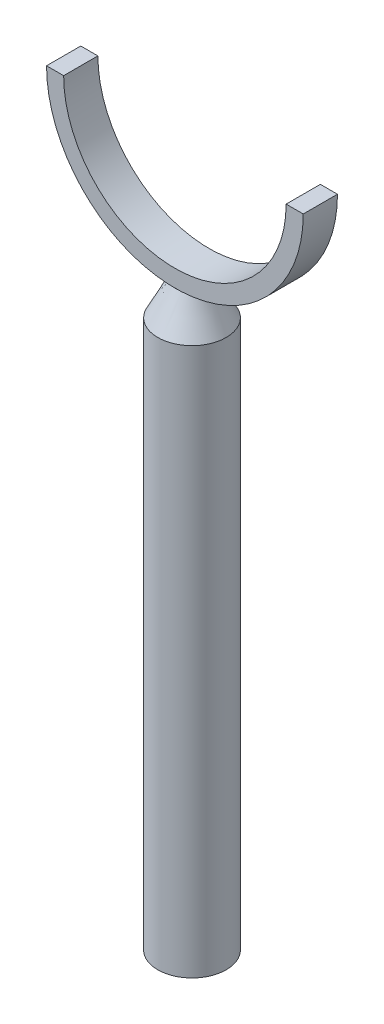
ISO-10303-21;
HEADER;
FILE_DESCRIPTION(('STEP AP214'),'2;1');
FILE_NAME('part.step','',(''),(''),'','','');
FILE_SCHEMA(('AUTOMOTIVE_DESIGN { 1 0 10303 214 1 1 1 1 }'));
ENDSEC;
DATA;
#1=APPLICATION_CONTEXT('core data for automotive mechanical design processes');
#2=APPLICATION_PROTOCOL_DEFINITION('international standard','automotive_design',2000,#1);
#3=PRODUCT_CONTEXT('',#1,'mechanical');
#4=PRODUCT('Part','Part','',(#3));
#5=PRODUCT_RELATED_PRODUCT_CATEGORY('part','',(#4));
#6=PRODUCT_DEFINITION_FORMATION('','',#4);
#7=PRODUCT_DEFINITION_CONTEXT('part definition',#1,'design');
#8=PRODUCT_DEFINITION('design','',#6,#7);
#9=PRODUCT_DEFINITION_SHAPE('','',#8);
#10=(LENGTH_UNIT() NAMED_UNIT(*) SI_UNIT(.MILLI.,.METRE.));
#11=(NAMED_UNIT(*) PLANE_ANGLE_UNIT() SI_UNIT($,.RADIAN.));
#12=(NAMED_UNIT(*) SI_UNIT($,.STERADIAN.) SOLID_ANGLE_UNIT());
#13=UNCERTAINTY_MEASURE_WITH_UNIT(LENGTH_MEASURE(1.E-05),#10,'distance_accuracy_value','');
#14=(GEOMETRIC_REPRESENTATION_CONTEXT(3) GLOBAL_UNCERTAINTY_ASSIGNED_CONTEXT((#13)) GLOBAL_UNIT_ASSIGNED_CONTEXT((#10,
#11,#12)) REPRESENTATION_CONTEXT('',''));
#15=CARTESIAN_POINT('',(0.,0.,0.));
#16=DIRECTION('',(0.,0.,1.));
#17=DIRECTION('',(1.,0.,0.));
#18=AXIS2_PLACEMENT_3D('',#15,#16,#17);
#19=CARTESIAN_POINT('',(0.,207.5,4.99999999999999));
#20=DIRECTION('',(0.,0.,-1.));
#21=DIRECTION('',(-1.,0.,0.));
#22=AXIS2_PLACEMENT_3D('',#19,#20,#21);
#23=CYLINDRICAL_SURFACE('',#22,32.5);
#24=DIRECTION('',(0.,0.,-1.));
#25=VECTOR('',#24,1.);
#26=CARTESIAN_POINT('',(32.5,207.5,4.99999999999999));
#27=LINE('',#26,#25);
#28=CARTESIAN_POINT('',(32.5,207.5,4.99999999999999));
#29=VERTEX_POINT('',#28);
#30=CARTESIAN_POINT('',(32.5,207.5,-4.99999999999999));
#31=VERTEX_POINT('',#30);
#32=EDGE_CURVE('E58',#29,#31,#27,.T.);
#33=ORIENTED_EDGE('',*,*,#32,.T.);
#34=CARTESIAN_POINT('',(0.,207.5,-4.99999999999999));
#35=DIRECTION('',(0.,0.,1.));
#36=DIRECTION('',(1.,0.,0.));
#37=AXIS2_PLACEMENT_3D('',#34,#35,#36);
#38=CIRCLE('',#37,32.5);
#39=CARTESIAN_POINT('',(-32.5,207.5,-4.99999999999999));
#40=VERTEX_POINT('',#39);
#41=EDGE_CURVE('E95',#40,#31,#38,.T.);
#42=ORIENTED_EDGE('',*,*,#41,.F.);
#43=DIRECTION('',(0.,0.,-1.));
#44=VECTOR('',#43,1.);
#45=CARTESIAN_POINT('',(-32.5,207.5,4.99999999999999));
#46=LINE('',#45,#44);
#47=CARTESIAN_POINT('',(-32.5,207.5,4.99999999999999));
#48=VERTEX_POINT('',#47);
#49=EDGE_CURVE('E13',#48,#40,#46,.T.);
#50=ORIENTED_EDGE('',*,*,#49,.F.);
#51=CARTESIAN_POINT('',(0.,207.5,4.99999999999999));
#52=DIRECTION('',(0.,0.,1.));
#53=DIRECTION('',(1.,0.,0.));
#54=AXIS2_PLACEMENT_3D('',#51,#52,#53);
#55=CIRCLE('',#54,32.5);
#56=EDGE_CURVE('E96',#48,#29,#55,.T.);
#57=ORIENTED_EDGE('',*,*,#56,.T.);
#58=EDGE_LOOP('',(#33,#42,#50,#57));
#59=FACE_BOUND('',#58,.T.);
#60=ADVANCED_FACE('F55',(#59),#23,.F.);
#61=CARTESIAN_POINT('',(-37.5,207.5,4.99999999999999));
#62=DIRECTION('',(0.,1.,0.));
#63=DIRECTION('',(0.,0.,1.));
#64=AXIS2_PLACEMENT_3D('',#61,#62,#63);
#65=PLANE('',#64);
#66=ORIENTED_EDGE('',*,*,#49,.T.);
#67=DIRECTION('',(1.,0.,0.));
#68=VECTOR('',#67,1.);
#69=CARTESIAN_POINT('',(-37.5,207.5,-4.99999999999999));
#70=LINE('',#69,#68);
#71=CARTESIAN_POINT('',(-37.5,207.5,-4.99999999999999));
#72=VERTEX_POINT('',#71);
#73=EDGE_CURVE('E113',#72,#40,#70,.T.);
#74=ORIENTED_EDGE('',*,*,#73,.F.);
#75=DIRECTION('',(0.,0.,-1.));
#76=VECTOR('',#75,1.);
#77=CARTESIAN_POINT('',(-37.5,207.5,4.99999999999999));
#78=LINE('',#77,#76);
#79=CARTESIAN_POINT('',(-37.5,207.5,4.99999999999999));
#80=VERTEX_POINT('',#79);
#81=EDGE_CURVE('E63',#80,#72,#78,.T.);
#82=ORIENTED_EDGE('',*,*,#81,.F.);
#83=DIRECTION('',(1.,0.,0.));
#84=VECTOR('',#83,1.);
#85=CARTESIAN_POINT('',(-37.5,207.5,4.99999999999999));
#86=LINE('',#85,#84);
#87=EDGE_CURVE('E101',#80,#48,#86,.T.);
#88=ORIENTED_EDGE('',*,*,#87,.T.);
#89=EDGE_LOOP('',(#66,#74,#82,#88));
#90=FACE_BOUND('',#89,.T.);
#91=ADVANCED_FACE('F127',(#90),#65,.T.);
#92=CARTESIAN_POINT('',(0.,207.5,4.99999999999999));
#93=DIRECTION('',(0.,0.,-1.));
#94=DIRECTION('',(-1.,0.,0.));
#95=AXIS2_PLACEMENT_3D('',#92,#93,#94);
#96=CYLINDRICAL_SURFACE('',#95,37.5);
#97=ORIENTED_EDGE('',*,*,#81,.T.);
#98=CARTESIAN_POINT('',(0.,207.5,-4.99999999999999));
#99=DIRECTION('',(0.,0.,1.));
#100=DIRECTION('',(1.,0.,0.));
#101=AXIS2_PLACEMENT_3D('',#98,#99,#100);
#102=CIRCLE('',#101,37.5);
#103=CARTESIAN_POINT('',(37.5,207.5,-4.99999999999999));
#104=VERTEX_POINT('',#103);
#105=EDGE_CURVE('E109',#72,#104,#102,.T.);
#106=ORIENTED_EDGE('',*,*,#105,.T.);
#107=DIRECTION('',(0.,0.,-1.));
#108=VECTOR('',#107,1.);
#109=CARTESIAN_POINT('',(37.5,207.5,4.99999999999999));
#110=LINE('',#109,#108);
#111=CARTESIAN_POINT('',(37.5,207.5,4.99999999999999));
#112=VERTEX_POINT('',#111);
#113=EDGE_CURVE('E100',#112,#104,#110,.T.);
#114=ORIENTED_EDGE('',*,*,#113,.F.);
#115=CARTESIAN_POINT('',(0.,207.5,4.99999999999999));
#116=DIRECTION('',(0.,0.,1.));
#117=DIRECTION('',(1.,0.,0.));
#118=AXIS2_PLACEMENT_3D('',#115,#116,#117);
#119=CIRCLE('',#118,37.5);
#120=EDGE_CURVE('E121',#80,#112,#119,.T.);
#121=ORIENTED_EDGE('',*,*,#120,.F.);
#122=EDGE_LOOP('',(#97,#106,#114,#121));
#123=FACE_BOUND('',#122,.T.);
#124=ADVANCED_FACE('F125',(#123),#96,.T.);
#125=CARTESIAN_POINT('',(32.5,207.5,4.99999999999999));
#126=DIRECTION('',(0.,1.,0.));
#127=DIRECTION('',(0.,0.,1.));
#128=AXIS2_PLACEMENT_3D('',#125,#126,#127);
#129=PLANE('',#128);
#130=ORIENTED_EDGE('',*,*,#113,.T.);
#131=DIRECTION('',(1.,0.,0.));
#132=VECTOR('',#131,1.);
#133=CARTESIAN_POINT('',(32.5,207.5,-4.99999999999999));
#134=LINE('',#133,#132);
#135=EDGE_CURVE('E103',#31,#104,#134,.T.);
#136=ORIENTED_EDGE('',*,*,#135,.F.);
#137=ORIENTED_EDGE('',*,*,#32,.F.);
#138=DIRECTION('',(1.,0.,0.));
#139=VECTOR('',#138,1.);
#140=CARTESIAN_POINT('',(32.5,207.5,4.99999999999999));
#141=LINE('',#140,#139);
#142=EDGE_CURVE('E119',#29,#112,#141,.T.);
#143=ORIENTED_EDGE('',*,*,#142,.T.);
#144=EDGE_LOOP('',(#130,#136,#137,#143));
#145=FACE_BOUND('',#144,.T.);
#146=ADVANCED_FACE('F104',(#145),#129,.T.);
#147=CARTESIAN_POINT('',(0.,207.5,4.99999999999999));
#148=DIRECTION('',(0.,0.,1.));
#149=DIRECTION('',(1.,0.,0.));
#150=AXIS2_PLACEMENT_3D('',#147,#148,#149);
#151=PLANE('',#150);
#152=ORIENTED_EDGE('',*,*,#56,.F.);
#153=ORIENTED_EDGE('',*,*,#87,.F.);
#154=ORIENTED_EDGE('',*,*,#120,.T.);
#155=ORIENTED_EDGE('',*,*,#142,.F.);
#156=EDGE_LOOP('',(#152,#153,#154,#155));
#157=FACE_BOUND('',#156,.T.);
#158=ADVANCED_FACE('F129',(#157),#151,.T.);
#159=CARTESIAN_POINT('',(0.,207.5,-4.99999999999999));
#160=DIRECTION('',(0.,0.,1.));
#161=DIRECTION('',(1.,0.,0.));
#162=AXIS2_PLACEMENT_3D('',#159,#160,#161);
#163=PLANE('',#162);
#164=ORIENTED_EDGE('',*,*,#41,.T.);
#165=ORIENTED_EDGE('',*,*,#135,.T.);
#166=ORIENTED_EDGE('',*,*,#105,.F.);
#167=ORIENTED_EDGE('',*,*,#73,.T.);
#168=EDGE_LOOP('',(#164,#165,#166,#167));
#169=FACE_BOUND('',#168,.T.);
#170=ADVANCED_FACE('F112',(#169),#163,.F.);
#171=CLOSED_SHELL('',(#60,#91,#124,#146,#158,#170));
#172=MANIFOLD_SOLID_BREP('B2',#171);
#173=CARTESIAN_POINT('',(0.,160.,0.));
#174=DIRECTION('',(0.,-1.,0.));
#175=DIRECTION('',(0.,0.,-1.));
#176=AXIS2_PLACEMENT_3D('',#173,#174,#175);
#177=CYLINDRICAL_SURFACE('',#176,10.);
#178=CARTESIAN_POINT('',(0.,160.,0.));
#179=DIRECTION('',(0.,-1.,0.));
#180=DIRECTION('',(0.,0.,-1.));
#181=AXIS2_PLACEMENT_3D('',#178,#179,#180);
#182=CIRCLE('',#181,10.);
#183=CARTESIAN_POINT('',(0.941083133185143,160.,9.9556196460308));
#184=VERTEX_POINT('',#183);
#185=EDGE_CURVE('E54',#184,#184,#182,.F.);
#186=ORIENTED_EDGE('',*,*,#185,.F.);
#187=EDGE_LOOP('',(#186));
#188=FACE_BOUND('',#187,.T.);
#189=CARTESIAN_POINT('',(0.,0.,0.));
#190=DIRECTION('',(0.,1.,0.));
#191=DIRECTION('',(0.,0.,1.));
#192=AXIS2_PLACEMENT_3D('',#189,#190,#191);
#193=CIRCLE('',#192,10.);
#194=CARTESIAN_POINT('',(0.,0.,10.));
#195=VERTEX_POINT('',#194);
#196=EDGE_CURVE('E200',#195,#195,#193,.T.);
#197=ORIENTED_EDGE('',*,*,#196,.T.);
#198=EDGE_LOOP('',(#197));
#199=FACE_BOUND('',#198,.T.);
#200=ADVANCED_FACE('F191',(#188,#199),#177,.T.);
#201=CARTESIAN_POINT('',(0.,0.,0.));
#202=DIRECTION('',(0.,1.,0.));
#203=DIRECTION('',(0.,0.,1.));
#204=AXIS2_PLACEMENT_3D('',#201,#202,#203);
#205=PLANE('',#204);
#206=ORIENTED_EDGE('',*,*,#196,.F.);
#207=EDGE_LOOP('',(#206));
#208=FACE_BOUND('',#207,.T.);
#209=ADVANCED_FACE('F226',(#208),#205,.F.);
#210=CARTESIAN_POINT('',(0.,170.,0.));
#211=DIRECTION('',(0.,1.,0.));
#212=DIRECTION('',(0.,0.,1.));
#213=AXIS2_PLACEMENT_3D('',#210,#211,#212);
#214=PLANE('',#213);
#215=CARTESIAN_POINT('',(0.,170.,0.));
#216=DIRECTION('',(0.,1.,0.));
#217=DIRECTION('',(0.,0.,1.));
#218=AXIS2_PLACEMENT_3D('',#215,#216,#217);
#219=CIRCLE('',#218,5.);
#220=CARTESIAN_POINT('',(1.84646326654365,170.,4.64656576465942));
#221=VERTEX_POINT('',#220);
#222=EDGE_CURVE('E194',#221,#221,#219,.T.);
#223=ORIENTED_EDGE('',*,*,#222,.T.);
#224=EDGE_LOOP('',(#223));
#225=FACE_BOUND('',#224,.T.);
#226=ADVANCED_FACE('F216',(#225),#214,.T.);
#227=CARTESIAN_POINT('',(0.941083133185143,160.,9.9556196460308));
#228=CARTESIAN_POINT('',(1.84646326654365,170.,4.64656576465942));
#229=CARTESIAN_POINT('',(20.8523224252467,160.,8.07345337966052));
#230=CARTESIAN_POINT('',(11.1395947958625,170.,0.953639231572114));
#231=CARTESIAN_POINT('',(18.9701561588765,160.,-11.8377859124011));
#232=CARTESIAN_POINT('',(7.44666826277518,170.,-8.33949229774672));
#233=CARTESIAN_POINT('',(-0.941083133185141,160.,-9.9556196460308));
#234=CARTESIAN_POINT('',(-1.84646326654365,170.,-4.64656576465942));
#235=CARTESIAN_POINT('',(-20.8523224252468,160.,-8.07345337966052));
#236=CARTESIAN_POINT('',(-11.1395947958625,170.,-0.953639231572117));
#237=CARTESIAN_POINT('',(-18.9701561588765,160.,11.8377859124011));
#238=CARTESIAN_POINT('',(-7.44666826277518,170.,8.33949229774672));
#239=CARTESIAN_POINT('',(0.941083133185143,160.,9.9556196460308));
#240=CARTESIAN_POINT('',(1.84646326654365,170.,4.64656576465942));
#241=(BOUNDED_SURFACE() B_SPLINE_SURFACE(3,1,((#227,#228),(#229,#230),(#231,#232),(#233,#234),
(#235,#236),(#237,#238),(#239,#240)),.UNSPECIFIED.,.T.,.F.,.F.) B_SPLINE_SURFACE_WITH_KNOTS((4,
3,4),(2,2),(0.,0.5,1.),(0.,1.),
.UNSPECIFIED.) GEOMETRIC_REPRESENTATION_ITEM() RATIONAL_B_SPLINE_SURFACE(((1.,1.),
(0.333333333333333,0.333333333333333),(0.333333333333333,0.333333333333333),(1.,1.),
(0.333333333333333,0.333333333333333),(0.333333333333333,0.333333333333333),(1.,1.))) REPRESENTATION_ITEM('') SURFACE());
#242=CARTESIAN_POINT('',(0.941083133185143,160.,9.9556196460308));
#243=CARTESIAN_POINT('',(0.950514176240961,160.104166666667,9.90031700143318));
#244=CARTESIAN_POINT('',(0.959945219296779,160.208333333333,9.84501435683556));
#245=CARTESIAN_POINT('',(0.978807305408414,160.416666666667,9.73440906764033));
#246=CARTESIAN_POINT('',(0.988238348464232,160.520833333333,9.67910642304271));
#247=CARTESIAN_POINT('',(1.00710043457587,160.729166666667,9.56850113384747));
#248=CARTESIAN_POINT('',(1.01653147763169,160.833333333333,9.51319848924985));
#249=CARTESIAN_POINT('',(1.03539356374332,161.041666666667,9.40259320005461));
#250=CARTESIAN_POINT('',(1.04482460679914,161.145833333333,9.347290555457));
#251=CARTESIAN_POINT('',(1.06368669291077,161.354166666667,9.23668526626176));
#252=CARTESIAN_POINT('',(1.07311773596659,161.458333333333,9.18138262166414));
#253=CARTESIAN_POINT('',(1.09197982207823,161.666666666667,9.0707773324689));
#254=CARTESIAN_POINT('',(1.10141086513405,161.770833333333,9.01547468787128));
#255=CARTESIAN_POINT('',(1.12027295124568,161.979166666667,8.90486939867605));
#256=CARTESIAN_POINT('',(1.1297039943015,162.083333333333,8.84956675407843));
#257=CARTESIAN_POINT('',(1.14856608041313,162.291666666667,8.73896146488319));
#258=CARTESIAN_POINT('',(1.15799712346895,162.395833333333,8.68365882028557));
#259=CARTESIAN_POINT('',(1.17685920958059,162.604166666667,8.57305353109033));
#260=CARTESIAN_POINT('',(1.18629025263641,162.708333333333,8.51775088649271));
#261=CARTESIAN_POINT('',(1.20515233874804,162.916666666667,8.40714559729748));
#262=CARTESIAN_POINT('',(1.21458338180386,163.020833333333,8.35184295269986));
#263=CARTESIAN_POINT('',(1.23344546791549,163.229166666667,8.24123766350463));
#264=CARTESIAN_POINT('',(1.24287651097131,163.333333333333,8.18593501890701));
#265=CARTESIAN_POINT('',(1.26173859708295,163.541666666667,8.07532972971177));
#266=CARTESIAN_POINT('',(1.27116964013877,163.645833333333,8.02002708511415));
#267=CARTESIAN_POINT('',(1.2900317262504,163.854166666667,7.90942179591891));
#268=CARTESIAN_POINT('',(1.29946276930622,163.958333333333,7.8541191513213));
#269=CARTESIAN_POINT('',(1.31832485541786,164.166666666667,7.74351386212606));
#270=CARTESIAN_POINT('',(1.32775589847367,164.270833333333,7.68821121752844));
#271=CARTESIAN_POINT('',(1.34661798458531,164.479166666667,7.5776059283332));
#272=CARTESIAN_POINT('',(1.35604902764113,164.583333333333,7.52230328373558));
#273=CARTESIAN_POINT('',(1.37491111375276,164.791666666667,7.41169799454035));
#274=CARTESIAN_POINT('',(1.38434215680858,164.895833333333,7.35639534994273));
#275=CARTESIAN_POINT('',(1.40320424292022,165.104166666667,7.24579006074749));
#276=CARTESIAN_POINT('',(1.41263528597603,165.208333333333,7.19048741614987));
#277=CARTESIAN_POINT('',(1.43149737208767,165.416666666667,7.07988212695463));
#278=CARTESIAN_POINT('',(1.44092841514349,165.520833333333,7.02457948235702));
#279=CARTESIAN_POINT('',(1.45979050125512,165.729166666667,6.91397419316178));
#280=CARTESIAN_POINT('',(1.46922154431094,165.833333333333,6.85867154856416));
#281=CARTESIAN_POINT('',(1.48808363042258,166.041666666667,6.74806625936892));
#282=CARTESIAN_POINT('',(1.49751467347839,166.145833333333,6.6927636147713));
#283=CARTESIAN_POINT('',(1.51637675959003,166.354166666667,6.58215832557607));
#284=CARTESIAN_POINT('',(1.52580780264585,166.458333333333,6.52685568097845));
#285=CARTESIAN_POINT('',(1.54466988875748,166.666666666667,6.41625039178321));
#286=CARTESIAN_POINT('',(1.5541009318133,166.770833333333,6.36094774718559));
#287=CARTESIAN_POINT('',(1.57296301792494,166.979166666667,6.25034245799035));
#288=CARTESIAN_POINT('',(1.58239406098075,167.083333333333,6.19503981339273));
#289=CARTESIAN_POINT('',(1.60125614709239,167.291666666667,6.0844345241975));
#290=CARTESIAN_POINT('',(1.61068719014821,167.395833333333,6.02913187959988));
#291=CARTESIAN_POINT('',(1.62954927625984,167.604166666667,5.91852659040465));
#292=CARTESIAN_POINT('',(1.63898031931566,167.708333333333,5.86322394580703));
#293=CARTESIAN_POINT('',(1.6578424054273,167.916666666667,5.75261865661179));
#294=CARTESIAN_POINT('',(1.66727344848311,168.020833333333,5.69731601201417));
#295=CARTESIAN_POINT('',(1.68613553459475,168.229166666667,5.58671072281893));
#296=CARTESIAN_POINT('',(1.69556657765057,168.333333333333,5.53140807822132));
#297=CARTESIAN_POINT('',(1.7144286637622,168.541666666667,5.42080278902608));
#298=CARTESIAN_POINT('',(1.72385970681802,168.645833333333,5.36550014442846));
#299=CARTESIAN_POINT('',(1.74272179292966,168.854166666667,5.25489485523322));
#300=CARTESIAN_POINT('',(1.75215283598547,168.958333333333,5.1995922106356));
#301=CARTESIAN_POINT('',(1.77101492209711,169.166666666667,5.08898692144036));
#302=CARTESIAN_POINT('',(1.78044596515293,169.270833333333,5.03368427684275));
#303=CARTESIAN_POINT('',(1.79930805126456,169.479166666667,4.92307898764751));
#304=CARTESIAN_POINT('',(1.80873909432038,169.583333333333,4.86777634304989));
#305=CARTESIAN_POINT('',(1.82760118043202,169.791666666667,4.75717105385465));
#306=CARTESIAN_POINT('',(1.83703222348783,169.895833333333,4.70186840925703));
#307=CARTESIAN_POINT('',(1.84646326654365,170.,4.64656576465942));
#308=B_SPLINE_CURVE_WITH_KNOTS('',3,(#242,#243,#244,#245,#246,#247,#248,#249,#250,#251,#252,
#253,#254,#255,#256,#257,#258,#259,#260,#261,#262,#263,#264,#265,#266,#267,#268,#269,#270,#271,
#272,#273,#274,#275,#276,#277,#278,#279,#280,#281,#282,#283,#284,#285,#286,#287,#288,#289,#290,
#291,#292,#293,#294,#295,#296,#297,#298,#299,#300,#301,#302,#303,#304,#305,#306,#307),
.UNSPECIFIED.,.F.,.F.,(4,2,2,2,2,2,2,2,2,2,2,2,2,2,2,2,2,2,2,2,2,2,2,2,2,2,2,2,2,2,2,2,4),(0.,
0.35493970425059,0.709879408501181,1.06481911275177,1.41975881700239,1.77469852125298,
2.12963822550357,2.48457792975418,2.83951763400477,3.19445733825536,3.54939704250598,
3.90433674675657,4.25927645100716,4.61421615525775,4.96915585950834,5.32409556375895,
5.67903526800955,6.03397497226014,6.38891467651075,6.74385438076134,7.09879408501193,
7.45373378926252,7.80867349351311,8.1636131977637,8.51855290201432,8.87349260626491,
9.2284323105155,9.58337201476611,9.9383117190167,10.2932514232673,10.6481911275179,
11.0031308317685,11.3580705360191),.UNSPECIFIED.);
#309=EDGE_CURVE('BSEAM225',#184,#221,#308,.T.);
#310=ORIENTED_EDGE('',*,*,#185,.T.);
#311=ORIENTED_EDGE('',*,*,#222,.F.);
#312=ORIENTED_EDGE('',*,*,#309,.T.);
#313=ORIENTED_EDGE('',*,*,#309,.F.);
#314=EDGE_LOOP('',(#310,#312,#311,#313));
#315=FACE_BOUND('',#314,.T.);
#316=ADVANCED_FACE('F225',(#315),#241,.T.);
#317=CLOSED_SHELL('',(#200,#209,#226,#316));
#318=MANIFOLD_SOLID_BREP('B7',#317);
#319=ADVANCED_BREP_SHAPE_REPRESENTATION('',(#18,#172,#318),#14);
#320=SHAPE_DEFINITION_REPRESENTATION(#9,#319);
ENDSEC;
END-ISO-10303-21;
